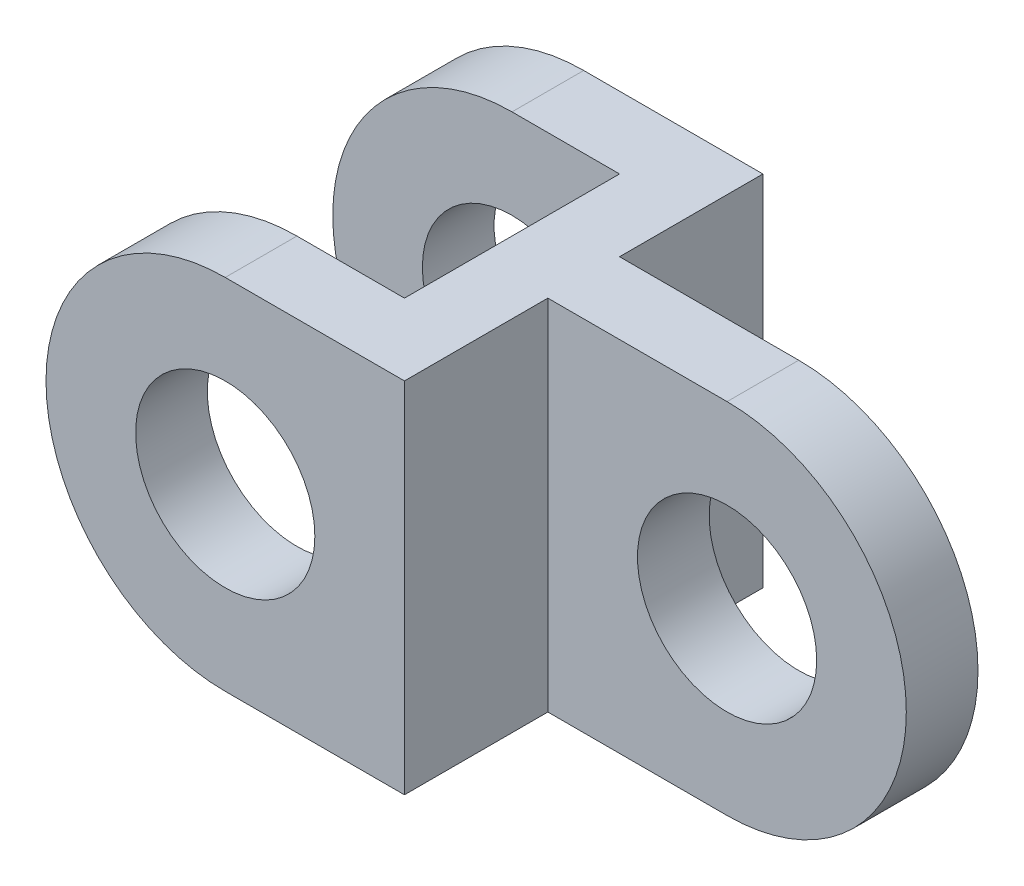
ISO-10303-21;
HEADER;
FILE_DESCRIPTION(('STEP AP214'),'2;1');
FILE_NAME('part.step','',(''),(''),'','','');
FILE_SCHEMA(('AUTOMOTIVE_DESIGN { 1 0 10303 214 1 1 1 1 }'));
ENDSEC;
DATA;
#1=APPLICATION_CONTEXT('core data for automotive mechanical design processes');
#2=APPLICATION_PROTOCOL_DEFINITION('international standard','automotive_design',2000,#1);
#3=PRODUCT_CONTEXT('',#1,'mechanical');
#4=PRODUCT('Part','Part','',(#3));
#5=PRODUCT_RELATED_PRODUCT_CATEGORY('part','',(#4));
#6=PRODUCT_DEFINITION_FORMATION('','',#4);
#7=PRODUCT_DEFINITION_CONTEXT('part definition',#1,'design');
#8=PRODUCT_DEFINITION('design','',#6,#7);
#9=PRODUCT_DEFINITION_SHAPE('','',#8);
#10=(LENGTH_UNIT() NAMED_UNIT(*) SI_UNIT(.MILLI.,.METRE.));
#11=(NAMED_UNIT(*) PLANE_ANGLE_UNIT() SI_UNIT($,.RADIAN.));
#12=(NAMED_UNIT(*) SI_UNIT($,.STERADIAN.) SOLID_ANGLE_UNIT());
#13=UNCERTAINTY_MEASURE_WITH_UNIT(LENGTH_MEASURE(1.E-05),#10,'distance_accuracy_value','');
#14=(GEOMETRIC_REPRESENTATION_CONTEXT(3) GLOBAL_UNCERTAINTY_ASSIGNED_CONTEXT((#13)) GLOBAL_UNIT_ASSIGNED_CONTEXT((#10,
#11,#12)) REPRESENTATION_CONTEXT('',''));
#15=CARTESIAN_POINT('',(0.,0.,0.));
#16=DIRECTION('',(0.,0.,1.));
#17=DIRECTION('',(1.,0.,0.));
#18=AXIS2_PLACEMENT_3D('',#15,#16,#17);
#19=CARTESIAN_POINT('',(50.,50.,-40.));
#20=DIRECTION('',(0.,0.,1.));
#21=DIRECTION('',(1.,0.,0.));
#22=AXIS2_PLACEMENT_3D('',#19,#20,#21);
#23=CYLINDRICAL_SURFACE('',#22,50.);
#24=DIRECTION('',(0.,0.,1.));
#25=VECTOR('',#24,1.);
#26=CARTESIAN_POINT('',(50.,100.,0.));
#27=LINE('',#26,#25);
#28=CARTESIAN_POINT('',(50.,100.,-40.));
#29=VERTEX_POINT('',#28);
#30=CARTESIAN_POINT('',(50.,100.,-60.));
#31=VERTEX_POINT('',#30);
#32=EDGE_CURVE('E228',#29,#31,#27,.F.);
#33=ORIENTED_EDGE('',*,*,#32,.F.);
#34=CARTESIAN_POINT('',(50.,50.,-40.));
#35=DIRECTION('',(0.,0.,-1.));
#36=DIRECTION('',(-1.,0.,0.));
#37=AXIS2_PLACEMENT_3D('',#34,#35,#36);
#38=CIRCLE('',#37,50.);
#39=CARTESIAN_POINT('',(50.,0.,-40.));
#40=VERTEX_POINT('',#39);
#41=EDGE_CURVE('E45',#40,#29,#38,.F.);
#42=ORIENTED_EDGE('',*,*,#41,.F.);
#43=DIRECTION('',(0.,0.,-1.));
#44=VECTOR('',#43,1.);
#45=CARTESIAN_POINT('',(50.,0.,-40.));
#46=LINE('',#45,#44);
#47=CARTESIAN_POINT('',(50.,0.,-60.));
#48=VERTEX_POINT('',#47);
#49=EDGE_CURVE('E129',#48,#40,#46,.F.);
#50=ORIENTED_EDGE('',*,*,#49,.F.);
#51=CARTESIAN_POINT('',(50.,50.,-60.));
#52=DIRECTION('',(0.,0.,-1.));
#53=DIRECTION('',(-1.,0.,0.));
#54=AXIS2_PLACEMENT_3D('',#51,#52,#53);
#55=CIRCLE('',#54,50.);
#56=EDGE_CURVE('E11',#31,#48,#55,.T.);
#57=ORIENTED_EDGE('',*,*,#56,.F.);
#58=EDGE_LOOP('',(#33,#42,#50,#57));
#59=FACE_BOUND('',#58,.T.);
#60=ADVANCED_FACE('F37',(#59),#23,.T.);
#61=CARTESIAN_POINT('',(0.,100.,-100.));
#62=DIRECTION('',(-1.,0.,0.));
#63=DIRECTION('',(0.,0.,1.));
#64=AXIS2_PLACEMENT_3D('',#61,#62,#63);
#65=PLANE('',#64);
#66=DIRECTION('',(0.,-1.,0.));
#67=VECTOR('',#66,1.);
#68=CARTESIAN_POINT('',(0.,0.,-40.));
#69=LINE('',#68,#67);
#70=CARTESIAN_POINT('',(0.,100.,-40.));
#71=VERTEX_POINT('',#70);
#72=CARTESIAN_POINT('',(0.,0.,-40.));
#73=VERTEX_POINT('',#72);
#74=EDGE_CURVE('E140',#71,#73,#69,.T.);
#75=ORIENTED_EDGE('',*,*,#74,.F.);
#76=DIRECTION('',(0.,0.,-1.));
#77=VECTOR('',#76,1.);
#78=CARTESIAN_POINT('',(0.,100.,-100.));
#79=LINE('',#78,#77);
#80=CARTESIAN_POINT('',(0.,100.,0.));
#81=VERTEX_POINT('',#80);
#82=EDGE_CURVE('E183',#81,#71,#79,.T.);
#83=ORIENTED_EDGE('',*,*,#82,.F.);
#84=DIRECTION('',(0.,-1.,0.));
#85=VECTOR('',#84,1.);
#86=CARTESIAN_POINT('',(0.,100.,0.));
#87=LINE('',#86,#85);
#88=CARTESIAN_POINT('',(0.,0.,0.));
#89=VERTEX_POINT('',#88);
#90=EDGE_CURVE('E143',#81,#89,#87,.T.);
#91=ORIENTED_EDGE('',*,*,#90,.T.);
#92=DIRECTION('',(0.,0.,-1.));
#93=VECTOR('',#92,1.);
#94=CARTESIAN_POINT('',(0.,0.,-100.));
#95=LINE('',#94,#93);
#96=EDGE_CURVE('E128',#89,#73,#95,.T.);
#97=ORIENTED_EDGE('',*,*,#96,.T.);
#98=EDGE_LOOP('',(#75,#83,#91,#97));
#99=FACE_BOUND('',#98,.T.);
#100=ADVANCED_FACE('F138',(#99),#65,.F.);
#101=CARTESIAN_POINT('',(-50.,50.,0.));
#102=DIRECTION('',(0.,0.,1.));
#103=DIRECTION('',(1.,0.,0.));
#104=AXIS2_PLACEMENT_3D('',#101,#102,#103);
#105=CYLINDRICAL_SURFACE('',#104,50.);
#106=DIRECTION('',(0.,0.,1.));
#107=VECTOR('',#106,1.);
#108=CARTESIAN_POINT('',(-50.,0.,0.));
#109=LINE('',#108,#107);
#110=CARTESIAN_POINT('',(-50.,0.,0.));
#111=VERTEX_POINT('',#110);
#112=CARTESIAN_POINT('',(-50.,0.,-20.));
#113=VERTEX_POINT('',#112);
#114=EDGE_CURVE('E218',#111,#113,#109,.F.);
#115=ORIENTED_EDGE('',*,*,#114,.F.);
#116=CARTESIAN_POINT('',(-50.,50.,0.));
#117=DIRECTION('',(0.,0.,-1.));
#118=DIRECTION('',(-1.,0.,0.));
#119=AXIS2_PLACEMENT_3D('',#116,#117,#118);
#120=CIRCLE('',#119,50.);
#121=CARTESIAN_POINT('',(-50.,100.,0.));
#122=VERTEX_POINT('',#121);
#123=EDGE_CURVE('E224',#122,#111,#120,.F.);
#124=ORIENTED_EDGE('',*,*,#123,.F.);
#125=DIRECTION('',(0.,0.,-1.));
#126=VECTOR('',#125,1.);
#127=CARTESIAN_POINT('',(-50.,100.,0.));
#128=LINE('',#127,#126);
#129=CARTESIAN_POINT('',(-50.,100.,-20.));
#130=VERTEX_POINT('',#129);
#131=EDGE_CURVE('E221',#130,#122,#128,.F.);
#132=ORIENTED_EDGE('',*,*,#131,.F.);
#133=CARTESIAN_POINT('',(-50.,50.,-20.));
#134=DIRECTION('',(0.,0.,1.));
#135=DIRECTION('',(1.,0.,0.));
#136=AXIS2_PLACEMENT_3D('',#133,#134,#135);
#137=CIRCLE('',#136,50.);
#138=EDGE_CURVE('E226',#113,#130,#137,.F.);
#139=ORIENTED_EDGE('',*,*,#138,.F.);
#140=EDGE_LOOP('',(#115,#124,#132,#139));
#141=FACE_BOUND('',#140,.T.);
#142=ADVANCED_FACE('F287',(#141),#105,.T.);
#143=CARTESIAN_POINT('',(-50.,50.,-100.));
#144=DIRECTION('',(0.,0.,1.));
#145=DIRECTION('',(1.,0.,0.));
#146=AXIS2_PLACEMENT_3D('',#143,#144,#145);
#147=CYLINDRICAL_SURFACE('',#146,50.);
#148=DIRECTION('',(0.,0.,-1.));
#149=VECTOR('',#148,1.);
#150=CARTESIAN_POINT('',(-50.,100.,-100.));
#151=LINE('',#150,#149);
#152=CARTESIAN_POINT('',(-50.,100.,-100.));
#153=VERTEX_POINT('',#152);
#154=CARTESIAN_POINT('',(-50.,100.,-80.));
#155=VERTEX_POINT('',#154);
#156=EDGE_CURVE('E208',#153,#155,#151,.F.);
#157=ORIENTED_EDGE('',*,*,#156,.F.);
#158=CARTESIAN_POINT('',(-50.,50.,-100.));
#159=DIRECTION('',(0.,0.,1.));
#160=DIRECTION('',(1.,0.,0.));
#161=AXIS2_PLACEMENT_3D('',#158,#159,#160);
#162=CIRCLE('',#161,50.);
#163=CARTESIAN_POINT('',(-50.,0.,-100.));
#164=VERTEX_POINT('',#163);
#165=EDGE_CURVE('E214',#164,#153,#162,.F.);
#166=ORIENTED_EDGE('',*,*,#165,.F.);
#167=DIRECTION('',(0.,0.,1.));
#168=VECTOR('',#167,1.);
#169=CARTESIAN_POINT('',(-50.,0.,0.));
#170=LINE('',#169,#168);
#171=CARTESIAN_POINT('',(-50.,0.,-80.));
#172=VERTEX_POINT('',#171);
#173=EDGE_CURVE('E211',#172,#164,#170,.F.);
#174=ORIENTED_EDGE('',*,*,#173,.F.);
#175=CARTESIAN_POINT('',(-50.,50.,-80.));
#176=DIRECTION('',(0.,0.,-1.));
#177=DIRECTION('',(-1.,0.,0.));
#178=AXIS2_PLACEMENT_3D('',#175,#176,#177);
#179=CIRCLE('',#178,50.);
#180=EDGE_CURVE('E216',#155,#172,#179,.F.);
#181=ORIENTED_EDGE('',*,*,#180,.F.);
#182=EDGE_LOOP('',(#157,#166,#174,#181));
#183=FACE_BOUND('',#182,.T.);
#184=ADVANCED_FACE('F257',(#183),#147,.T.);
#185=CARTESIAN_POINT('',(-100.,100.,-80.));
#186=DIRECTION('',(0.,0.,-1.));
#187=DIRECTION('',(-1.,0.,0.));
#188=AXIS2_PLACEMENT_3D('',#185,#186,#187);
#189=PLANE('',#188);
#190=CARTESIAN_POINT('',(-50.,50.,-80.));
#191=DIRECTION('',(0.,0.,-1.));
#192=DIRECTION('',(-1.,0.,0.));
#193=AXIS2_PLACEMENT_3D('',#190,#191,#192);
#194=CIRCLE('',#193,25.);
#195=CARTESIAN_POINT('',(-75.,50.,-80.));
#196=VERTEX_POINT('',#195);
#197=EDGE_CURVE('E169',#196,#196,#194,.T.);
#198=ORIENTED_EDGE('',*,*,#197,.T.);
#199=EDGE_LOOP('',(#198));
#200=FACE_BOUND('',#199,.T.);
#201=DIRECTION('',(1.,0.,0.));
#202=VECTOR('',#201,1.);
#203=CARTESIAN_POINT('',(-100.,100.,-80.));
#204=LINE('',#203,#202);
#205=CARTESIAN_POINT('',(-20.,100.,-80.));
#206=VERTEX_POINT('',#205);
#207=EDGE_CURVE('E173',#155,#206,#204,.T.);
#208=ORIENTED_EDGE('',*,*,#207,.F.);
#209=ORIENTED_EDGE('',*,*,#180,.T.);
#210=DIRECTION('',(1.,0.,0.));
#211=VECTOR('',#210,1.);
#212=CARTESIAN_POINT('',(-100.,0.,-80.));
#213=LINE('',#212,#211);
#214=CARTESIAN_POINT('',(-20.,0.,-80.));
#215=VERTEX_POINT('',#214);
#216=EDGE_CURVE('E172',#172,#215,#213,.T.);
#217=ORIENTED_EDGE('',*,*,#216,.T.);
#218=DIRECTION('',(0.,-1.,0.));
#219=VECTOR('',#218,1.);
#220=CARTESIAN_POINT('',(-20.,100.,-80.));
#221=LINE('',#220,#219);
#222=EDGE_CURVE('E205',#206,#215,#221,.T.);
#223=ORIENTED_EDGE('',*,*,#222,.F.);
#224=EDGE_LOOP('',(#208,#209,#217,#223));
#225=FACE_BOUND('',#224,.T.);
#226=ADVANCED_FACE('F254',(#200,#225),#189,.F.);
#227=CARTESIAN_POINT('',(-20.,100.,-20.));
#228=DIRECTION('',(1.,0.,0.));
#229=DIRECTION('',(0.,0.,-1.));
#230=AXIS2_PLACEMENT_3D('',#227,#228,#229);
#231=PLANE('',#230);
#232=DIRECTION('',(0.,0.,1.));
#233=VECTOR('',#232,1.);
#234=CARTESIAN_POINT('',(-20.,0.,-20.));
#235=LINE('',#234,#233);
#236=CARTESIAN_POINT('',(-20.,0.,-20.));
#237=VERTEX_POINT('',#236);
#238=EDGE_CURVE('E190',#215,#237,#235,.T.);
#239=ORIENTED_EDGE('',*,*,#238,.T.);
#240=DIRECTION('',(0.,-1.,0.));
#241=VECTOR('',#240,1.);
#242=CARTESIAN_POINT('',(-20.,100.,-20.));
#243=LINE('',#242,#241);
#244=CARTESIAN_POINT('',(-20.,100.,-20.));
#245=VERTEX_POINT('',#244);
#246=EDGE_CURVE('E202',#245,#237,#243,.T.);
#247=ORIENTED_EDGE('',*,*,#246,.F.);
#248=DIRECTION('',(0.,0.,1.));
#249=VECTOR('',#248,1.);
#250=CARTESIAN_POINT('',(-20.,100.,-20.));
#251=LINE('',#250,#249);
#252=EDGE_CURVE('E175',#206,#245,#251,.T.);
#253=ORIENTED_EDGE('',*,*,#252,.F.);
#254=ORIENTED_EDGE('',*,*,#222,.T.);
#255=EDGE_LOOP('',(#239,#247,#253,#254));
#256=FACE_BOUND('',#255,.T.);
#257=ADVANCED_FACE('F247',(#256),#231,.F.);
#258=CARTESIAN_POINT('',(-100.,100.,-20.));
#259=DIRECTION('',(0.,0.,1.));
#260=DIRECTION('',(1.,0.,0.));
#261=AXIS2_PLACEMENT_3D('',#258,#259,#260);
#262=PLANE('',#261);
#263=CARTESIAN_POINT('',(-50.,50.,-20.));
#264=DIRECTION('',(0.,0.,1.));
#265=DIRECTION('',(1.,0.,0.));
#266=AXIS2_PLACEMENT_3D('',#263,#264,#265);
#267=CIRCLE('',#266,25.);
#268=CARTESIAN_POINT('',(-25.,50.,-20.));
#269=VERTEX_POINT('',#268);
#270=EDGE_CURVE('E164',#269,#269,#267,.T.);
#271=ORIENTED_EDGE('',*,*,#270,.T.);
#272=EDGE_LOOP('',(#271));
#273=FACE_BOUND('',#272,.T.);
#274=DIRECTION('',(-1.,0.,0.));
#275=VECTOR('',#274,1.);
#276=CARTESIAN_POINT('',(-100.,0.,-20.));
#277=LINE('',#276,#275);
#278=EDGE_CURVE('E192',#237,#113,#277,.T.);
#279=ORIENTED_EDGE('',*,*,#278,.T.);
#280=ORIENTED_EDGE('',*,*,#138,.T.);
#281=DIRECTION('',(-1.,0.,0.));
#282=VECTOR('',#281,1.);
#283=CARTESIAN_POINT('',(-100.,100.,-20.));
#284=LINE('',#283,#282);
#285=EDGE_CURVE('E177',#245,#130,#284,.T.);
#286=ORIENTED_EDGE('',*,*,#285,.F.);
#287=ORIENTED_EDGE('',*,*,#246,.T.);
#288=EDGE_LOOP('',(#279,#280,#286,#287));
#289=FACE_BOUND('',#288,.T.);
#290=ADVANCED_FACE('F242',(#273,#289),#262,.F.);
#291=CARTESIAN_POINT('',(0.,100.,0.));
#292=DIRECTION('',(0.,0.,-1.));
#293=DIRECTION('',(-1.,0.,0.));
#294=AXIS2_PLACEMENT_3D('',#291,#292,#293);
#295=PLANE('',#294);
#296=CARTESIAN_POINT('',(-50.,50.,0.));
#297=DIRECTION('',(0.,0.,1.));
#298=DIRECTION('',(1.,0.,0.));
#299=AXIS2_PLACEMENT_3D('',#296,#297,#298);
#300=CIRCLE('',#299,25.);
#301=CARTESIAN_POINT('',(-25.,50.,0.));
#302=VERTEX_POINT('',#301);
#303=EDGE_CURVE('E160',#302,#302,#300,.T.);
#304=ORIENTED_EDGE('',*,*,#303,.F.);
#305=EDGE_LOOP('',(#304));
#306=FACE_BOUND('',#305,.T.);
#307=DIRECTION('',(1.,0.,0.));
#308=VECTOR('',#307,1.);
#309=CARTESIAN_POINT('',(0.,100.,0.));
#310=LINE('',#309,#308);
#311=EDGE_CURVE('E180',#122,#81,#310,.T.);
#312=ORIENTED_EDGE('',*,*,#311,.F.);
#313=ORIENTED_EDGE('',*,*,#123,.T.);
#314=DIRECTION('',(1.,0.,0.));
#315=VECTOR('',#314,1.);
#316=CARTESIAN_POINT('',(0.,0.,0.));
#317=LINE('',#316,#315);
#318=EDGE_CURVE('E195',#111,#89,#317,.T.);
#319=ORIENTED_EDGE('',*,*,#318,.T.);
#320=ORIENTED_EDGE('',*,*,#90,.F.);
#321=EDGE_LOOP('',(#312,#313,#319,#320));
#322=FACE_BOUND('',#321,.T.);
#323=ADVANCED_FACE('F236',(#306,#322),#295,.F.);
#324=CARTESIAN_POINT('',(0.,100.,-60.));
#325=VERTEX_POINT('',#324);
#326=CARTESIAN_POINT('',(0.,100.,-100.));
#327=VERTEX_POINT('',#326);
#328=EDGE_CURVE('E182',#325,#327,#79,.T.);
#329=ORIENTED_EDGE('',*,*,#328,.F.);
#330=DIRECTION('',(0.,-1.,0.));
#331=VECTOR('',#330,1.);
#332=CARTESIAN_POINT('',(0.,0.,-60.));
#333=LINE('',#332,#331);
#334=CARTESIAN_POINT('',(0.,0.,-60.));
#335=VERTEX_POINT('',#334);
#336=EDGE_CURVE('E149',#325,#335,#333,.T.);
#337=ORIENTED_EDGE('',*,*,#336,.T.);
#338=CARTESIAN_POINT('',(0.,0.,-100.));
#339=VERTEX_POINT('',#338);
#340=EDGE_CURVE('E145',#335,#339,#95,.T.);
#341=ORIENTED_EDGE('',*,*,#340,.T.);
#342=DIRECTION('',(0.,-1.,0.));
#343=VECTOR('',#342,1.);
#344=CARTESIAN_POINT('',(0.,100.,-100.));
#345=LINE('',#344,#343);
#346=EDGE_CURVE('E188',#327,#339,#345,.T.);
#347=ORIENTED_EDGE('',*,*,#346,.F.);
#348=EDGE_LOOP('',(#329,#337,#341,#347));
#349=FACE_BOUND('',#348,.T.);
#350=ADVANCED_FACE('F265',(#349),#65,.F.);
#351=CARTESIAN_POINT('',(-100.,100.,-100.));
#352=DIRECTION('',(0.,0.,1.));
#353=DIRECTION('',(1.,0.,0.));
#354=AXIS2_PLACEMENT_3D('',#351,#352,#353);
#355=PLANE('',#354);
#356=CARTESIAN_POINT('',(-50.,50.,-100.));
#357=DIRECTION('',(0.,0.,1.));
#358=DIRECTION('',(1.,0.,0.));
#359=AXIS2_PLACEMENT_3D('',#356,#357,#358);
#360=CIRCLE('',#359,25.);
#361=CARTESIAN_POINT('',(-25.,50.,-100.));
#362=VERTEX_POINT('',#361);
#363=EDGE_CURVE('E161',#362,#362,#360,.T.);
#364=ORIENTED_EDGE('',*,*,#363,.T.);
#365=EDGE_LOOP('',(#364));
#366=FACE_BOUND('',#365,.T.);
#367=DIRECTION('',(-1.,0.,0.));
#368=VECTOR('',#367,1.);
#369=CARTESIAN_POINT('',(-100.,0.,-100.));
#370=LINE('',#369,#368);
#371=EDGE_CURVE('E144',#339,#164,#370,.T.);
#372=ORIENTED_EDGE('',*,*,#371,.T.);
#373=ORIENTED_EDGE('',*,*,#165,.T.);
#374=DIRECTION('',(-1.,0.,0.));
#375=VECTOR('',#374,1.);
#376=CARTESIAN_POINT('',(-100.,100.,-100.));
#377=LINE('',#376,#375);
#378=EDGE_CURVE('E185',#327,#153,#377,.T.);
#379=ORIENTED_EDGE('',*,*,#378,.F.);
#380=ORIENTED_EDGE('',*,*,#346,.T.);
#381=EDGE_LOOP('',(#372,#373,#379,#380));
#382=FACE_BOUND('',#381,.T.);
#383=ADVANCED_FACE('F260',(#366,#382),#355,.F.);
#384=CARTESIAN_POINT('',(0.,100.,0.));
#385=DIRECTION('',(0.,1.,0.));
#386=DIRECTION('',(0.,0.,1.));
#387=AXIS2_PLACEMENT_3D('',#384,#385,#386);
#388=PLANE('',#387);
#389=DIRECTION('',(-1.,0.,0.));
#390=VECTOR('',#389,1.);
#391=CARTESIAN_POINT('',(100.,100.,-40.));
#392=LINE('',#391,#390);
#393=EDGE_CURVE('E132',#29,#71,#392,.T.);
#394=ORIENTED_EDGE('',*,*,#393,.F.);
#395=ORIENTED_EDGE('',*,*,#32,.T.);
#396=DIRECTION('',(-1.,0.,0.));
#397=VECTOR('',#396,1.);
#398=CARTESIAN_POINT('',(100.,100.,-60.));
#399=LINE('',#398,#397);
#400=EDGE_CURVE('E158',#31,#325,#399,.T.);
#401=ORIENTED_EDGE('',*,*,#400,.T.);
#402=ORIENTED_EDGE('',*,*,#328,.T.);
#403=ORIENTED_EDGE('',*,*,#378,.T.);
#404=ORIENTED_EDGE('',*,*,#156,.T.);
#405=ORIENTED_EDGE('',*,*,#207,.T.);
#406=ORIENTED_EDGE('',*,*,#252,.T.);
#407=ORIENTED_EDGE('',*,*,#285,.T.);
#408=ORIENTED_EDGE('',*,*,#131,.T.);
#409=ORIENTED_EDGE('',*,*,#311,.T.);
#410=ORIENTED_EDGE('',*,*,#82,.T.);
#411=EDGE_LOOP('',(#394,#395,#401,#402,#403,#404,#405,#406,#407,#408,#409,#410));
#412=FACE_BOUND('',#411,.T.);
#413=ADVANCED_FACE('F232',(#412),#388,.T.);
#414=CARTESIAN_POINT('',(0.,0.,0.));
#415=DIRECTION('',(0.,1.,0.));
#416=DIRECTION('',(0.,0.,1.));
#417=AXIS2_PLACEMENT_3D('',#414,#415,#416);
#418=PLANE('',#417);
#419=DIRECTION('',(-1.,0.,0.));
#420=VECTOR('',#419,1.);
#421=CARTESIAN_POINT('',(100.,0.,-60.));
#422=LINE('',#421,#420);
#423=EDGE_CURVE('E133',#48,#335,#422,.T.);
#424=ORIENTED_EDGE('',*,*,#423,.F.);
#425=ORIENTED_EDGE('',*,*,#49,.T.);
#426=DIRECTION('',(-1.,0.,0.));
#427=VECTOR('',#426,1.);
#428=CARTESIAN_POINT('',(100.,0.,-40.));
#429=LINE('',#428,#427);
#430=EDGE_CURVE('E123',#40,#73,#429,.T.);
#431=ORIENTED_EDGE('',*,*,#430,.T.);
#432=ORIENTED_EDGE('',*,*,#96,.F.);
#433=ORIENTED_EDGE('',*,*,#318,.F.);
#434=ORIENTED_EDGE('',*,*,#114,.T.);
#435=ORIENTED_EDGE('',*,*,#278,.F.);
#436=ORIENTED_EDGE('',*,*,#238,.F.);
#437=ORIENTED_EDGE('',*,*,#216,.F.);
#438=ORIENTED_EDGE('',*,*,#173,.T.);
#439=ORIENTED_EDGE('',*,*,#371,.F.);
#440=ORIENTED_EDGE('',*,*,#340,.F.);
#441=EDGE_LOOP('',(#424,#425,#431,#432,#433,#434,#435,#436,#437,#438,#439,#440));
#442=FACE_BOUND('',#441,.T.);
#443=ADVANCED_FACE('F126',(#442),#418,.F.);
#444=CARTESIAN_POINT('',(-50.,50.,-100.));
#445=DIRECTION('',(0.,0.,1.));
#446=DIRECTION('',(1.,0.,0.));
#447=AXIS2_PLACEMENT_3D('',#444,#445,#446);
#448=CYLINDRICAL_SURFACE('',#447,25.);
#449=ORIENTED_EDGE('',*,*,#363,.F.);
#450=EDGE_LOOP('',(#449));
#451=FACE_BOUND('',#450,.T.);
#452=ORIENTED_EDGE('',*,*,#197,.F.);
#453=EDGE_LOOP('',(#452));
#454=FACE_BOUND('',#453,.T.);
#455=ADVANCED_FACE('F279',(#451,#454),#448,.F.);
#456=ORIENTED_EDGE('',*,*,#303,.T.);
#457=EDGE_LOOP('',(#456));
#458=FACE_BOUND('',#457,.T.);
#459=ORIENTED_EDGE('',*,*,#270,.F.);
#460=EDGE_LOOP('',(#459));
#461=FACE_BOUND('',#460,.T.);
#462=ADVANCED_FACE('F269',(#458,#461),#448,.F.);
#463=CARTESIAN_POINT('',(100.,0.,-60.));
#464=DIRECTION('',(0.,0.,-1.));
#465=DIRECTION('',(-1.,0.,0.));
#466=AXIS2_PLACEMENT_3D('',#463,#464,#465);
#467=PLANE('',#466);
#468=CARTESIAN_POINT('',(50.,50.,-60.));
#469=DIRECTION('',(0.,0.,-1.));
#470=DIRECTION('',(-1.,0.,0.));
#471=AXIS2_PLACEMENT_3D('',#468,#469,#470);
#472=CIRCLE('',#471,25.);
#473=CARTESIAN_POINT('',(75.,50.,-60.));
#474=VERTEX_POINT('',#473);
#475=EDGE_CURVE('E153',#474,#474,#472,.T.);
#476=ORIENTED_EDGE('',*,*,#475,.F.);
#477=EDGE_LOOP('',(#476));
#478=FACE_BOUND('',#477,.T.);
#479=ORIENTED_EDGE('',*,*,#400,.F.);
#480=ORIENTED_EDGE('',*,*,#56,.T.);
#481=ORIENTED_EDGE('',*,*,#423,.T.);
#482=ORIENTED_EDGE('',*,*,#336,.F.);
#483=EDGE_LOOP('',(#479,#480,#481,#482));
#484=FACE_BOUND('',#483,.T.);
#485=ADVANCED_FACE('F267',(#478,#484),#467,.T.);
#486=CARTESIAN_POINT('',(100.,0.,-40.));
#487=DIRECTION('',(0.,0.,-1.));
#488=DIRECTION('',(-1.,0.,0.));
#489=AXIS2_PLACEMENT_3D('',#486,#487,#488);
#490=PLANE('',#489);
#491=CARTESIAN_POINT('',(50.,50.,-40.));
#492=DIRECTION('',(0.,0.,1.));
#493=DIRECTION('',(1.,0.,0.));
#494=AXIS2_PLACEMENT_3D('',#491,#492,#493);
#495=CIRCLE('',#494,25.);
#496=CARTESIAN_POINT('',(75.,50.,-40.));
#497=VERTEX_POINT('',#496);
#498=EDGE_CURVE('E421',#497,#497,#495,.T.);
#499=ORIENTED_EDGE('',*,*,#498,.F.);
#500=EDGE_LOOP('',(#499));
#501=FACE_BOUND('',#500,.T.);
#502=ORIENTED_EDGE('',*,*,#430,.F.);
#503=ORIENTED_EDGE('',*,*,#41,.T.);
#504=ORIENTED_EDGE('',*,*,#393,.T.);
#505=ORIENTED_EDGE('',*,*,#74,.T.);
#506=EDGE_LOOP('',(#502,#503,#504,#505));
#507=FACE_BOUND('',#506,.T.);
#508=ADVANCED_FACE('F147',(#501,#507),#490,.F.);
#509=CARTESIAN_POINT('',(50.,50.,-100.));
#510=DIRECTION('',(0.,0.,1.));
#511=DIRECTION('',(1.,0.,0.));
#512=AXIS2_PLACEMENT_3D('',#509,#510,#511);
#513=CYLINDRICAL_SURFACE('',#512,25.);
#514=CARTESIAN_POINT('',(75.,50.,-60.));
#515=CARTESIAN_POINT('',(75.,50.,-59.7916666666667));
#516=CARTESIAN_POINT('',(75.,50.,-59.5833333333333));
#517=CARTESIAN_POINT('',(75.,50.,-59.1666666666667));
#518=CARTESIAN_POINT('',(75.,50.,-58.9583333333333));
#519=CARTESIAN_POINT('',(75.,50.,-58.5416666666667));
#520=CARTESIAN_POINT('',(75.,50.,-58.3333333333333));
#521=CARTESIAN_POINT('',(75.,50.,-57.9166666666667));
#522=CARTESIAN_POINT('',(75.,50.,-57.7083333333333));
#523=CARTESIAN_POINT('',(75.,50.,-57.2916666666667));
#524=CARTESIAN_POINT('',(75.,50.,-57.0833333333333));
#525=CARTESIAN_POINT('',(75.,50.,-56.6666666666667));
#526=CARTESIAN_POINT('',(75.,50.,-56.4583333333333));
#527=CARTESIAN_POINT('',(75.,50.,-56.0416666666667));
#528=CARTESIAN_POINT('',(75.,50.,-55.8333333333333));
#529=CARTESIAN_POINT('',(75.,50.,-55.4166666666667));
#530=CARTESIAN_POINT('',(75.,50.,-55.2083333333333));
#531=CARTESIAN_POINT('',(75.,50.,-54.7916666666667));
#532=CARTESIAN_POINT('',(75.,50.,-54.5833333333333));
#533=CARTESIAN_POINT('',(75.,50.,-54.1666666666667));
#534=CARTESIAN_POINT('',(75.,50.,-53.9583333333333));
#535=CARTESIAN_POINT('',(75.,50.,-53.5416666666667));
#536=CARTESIAN_POINT('',(75.,50.,-53.3333333333333));
#537=CARTESIAN_POINT('',(75.,50.,-52.9166666666667));
#538=CARTESIAN_POINT('',(75.,50.,-52.7083333333333));
#539=CARTESIAN_POINT('',(75.,50.,-52.2916666666667));
#540=CARTESIAN_POINT('',(75.,50.,-52.0833333333333));
#541=CARTESIAN_POINT('',(75.,50.,-51.6666666666667));
#542=CARTESIAN_POINT('',(75.,50.,-51.4583333333333));
#543=CARTESIAN_POINT('',(75.,50.,-51.0416666666667));
#544=CARTESIAN_POINT('',(75.,50.,-50.8333333333333));
#545=CARTESIAN_POINT('',(75.,50.,-50.4166666666667));
#546=CARTESIAN_POINT('',(75.,50.,-50.2083333333333));
#547=CARTESIAN_POINT('',(75.,50.,-49.7916666666667));
#548=CARTESIAN_POINT('',(75.,50.,-49.5833333333333));
#549=CARTESIAN_POINT('',(75.,50.,-49.1666666666667));
#550=CARTESIAN_POINT('',(75.,50.,-48.9583333333333));
#551=CARTESIAN_POINT('',(75.,50.,-48.5416666666667));
#552=CARTESIAN_POINT('',(75.,50.,-48.3333333333333));
#553=CARTESIAN_POINT('',(75.,50.,-47.9166666666667));
#554=CARTESIAN_POINT('',(75.,50.,-47.7083333333333));
#555=CARTESIAN_POINT('',(75.,50.,-47.2916666666667));
#556=CARTESIAN_POINT('',(75.,50.,-47.0833333333333));
#557=CARTESIAN_POINT('',(75.,50.,-46.6666666666667));
#558=CARTESIAN_POINT('',(75.,50.,-46.4583333333333));
#559=CARTESIAN_POINT('',(75.,50.,-46.0416666666667));
#560=CARTESIAN_POINT('',(75.,50.,-45.8333333333333));
#561=CARTESIAN_POINT('',(75.,50.,-45.4166666666667));
#562=CARTESIAN_POINT('',(75.,50.,-45.2083333333333));
#563=CARTESIAN_POINT('',(75.,50.,-44.7916666666667));
#564=CARTESIAN_POINT('',(75.,50.,-44.5833333333333));
#565=CARTESIAN_POINT('',(75.,50.,-44.1666666666667));
#566=CARTESIAN_POINT('',(75.,50.,-43.9583333333333));
#567=CARTESIAN_POINT('',(75.,50.,-43.5416666666667));
#568=CARTESIAN_POINT('',(75.,50.,-43.3333333333333));
#569=CARTESIAN_POINT('',(75.,50.,-42.9166666666667));
#570=CARTESIAN_POINT('',(75.,50.,-42.7083333333333));
#571=CARTESIAN_POINT('',(75.,50.,-42.2916666666667));
#572=CARTESIAN_POINT('',(75.,50.,-42.0833333333333));
#573=CARTESIAN_POINT('',(75.,50.,-41.6666666666667));
#574=CARTESIAN_POINT('',(75.,50.,-41.4583333333333));
#575=CARTESIAN_POINT('',(75.,50.,-41.0416666666667));
#576=CARTESIAN_POINT('',(75.,50.,-40.8333333333333));
#577=CARTESIAN_POINT('',(75.,50.,-40.4166666666667));
#578=CARTESIAN_POINT('',(75.,50.,-40.2083333333333));
#579=CARTESIAN_POINT('',(75.,50.,-40.));
#580=B_SPLINE_CURVE_WITH_KNOTS('',3,(#514,#515,#516,#517,#518,#519,#520,#521,#522,#523,#524,
#525,#526,#527,#528,#529,#530,#531,#532,#533,#534,#535,#536,#537,#538,#539,#540,#541,#542,#543,
#544,#545,#546,#547,#548,#549,#550,#551,#552,#553,#554,#555,#556,#557,#558,#559,#560,#561,#562,
#563,#564,#565,#566,#567,#568,#569,#570,#571,#572,#573,#574,#575,#576,#577,#578,#579),
.UNSPECIFIED.,.F.,.F.,(4,2,2,2,2,2,2,2,2,2,2,2,2,2,2,2,2,2,2,2,2,2,2,2,2,2,2,2,2,2,2,2,4),(0.,
0.625000000000001,1.25,1.875,2.5,3.125,3.75,4.375,5.,5.62500000000001,6.25000000000001,
6.87500000000001,7.50000000000001,8.12500000000001,8.75000000000001,9.37500000000001,10.,10.625,
11.25,11.875,12.5,13.125,13.75,14.375,15.,15.625,16.25,16.875,17.5,18.125,18.75,19.375,20.),.UNSPECIFIED.);
#581=EDGE_CURVE('BSEAM276',#474,#497,#580,.T.);
#582=ORIENTED_EDGE('',*,*,#475,.T.);
#583=ORIENTED_EDGE('',*,*,#498,.T.);
#584=ORIENTED_EDGE('',*,*,#581,.T.);
#585=ORIENTED_EDGE('',*,*,#581,.F.);
#586=EDGE_LOOP('',(#582,#584,#583,#585));
#587=FACE_BOUND('',#586,.T.);
#588=ADVANCED_FACE('F276',(#587),#513,.F.);
#589=CLOSED_SHELL('',(#60,#100,#142,#184,#226,#257,#290,#323,#350,#383,#413,#443,#455,#462,#485,
#508,#588));
#590=MANIFOLD_SOLID_BREP('B2',#589);
#591=ADVANCED_BREP_SHAPE_REPRESENTATION('',(#18,#590),#14);
#592=SHAPE_DEFINITION_REPRESENTATION(#9,#591);
ENDSEC;
END-ISO-10303-21;
